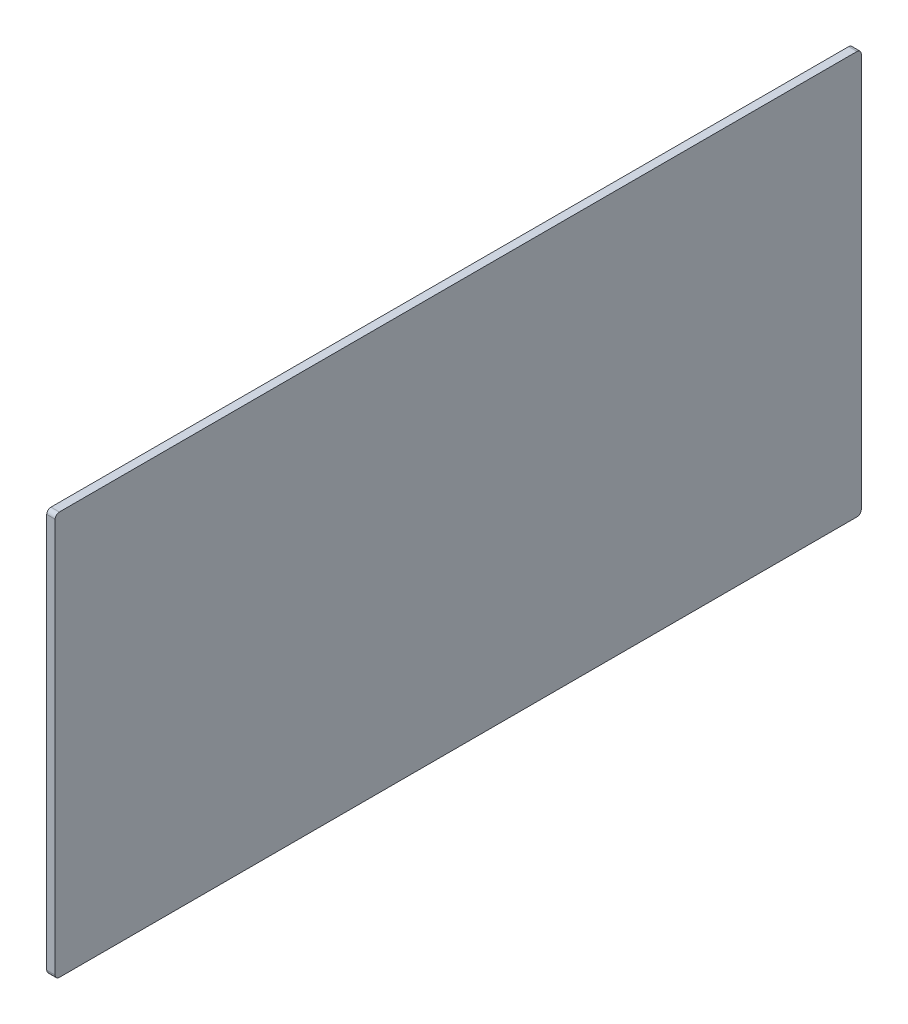
ISO-10303-21;
HEADER;
FILE_DESCRIPTION(('STEP AP214'),'2;1');
FILE_NAME('part.step','',(''),(''),'','','');
FILE_SCHEMA(('AUTOMOTIVE_DESIGN { 1 0 10303 214 1 1 1 1 }'));
ENDSEC;
DATA;
#1=APPLICATION_CONTEXT('core data for automotive mechanical design processes');
#2=APPLICATION_PROTOCOL_DEFINITION('international standard','automotive_design',2000,#1);
#3=PRODUCT_CONTEXT('',#1,'mechanical');
#4=PRODUCT('Part','Part','',(#3));
#5=PRODUCT_RELATED_PRODUCT_CATEGORY('part','',(#4));
#6=PRODUCT_DEFINITION_FORMATION('','',#4);
#7=PRODUCT_DEFINITION_CONTEXT('part definition',#1,'design');
#8=PRODUCT_DEFINITION('design','',#6,#7);
#9=PRODUCT_DEFINITION_SHAPE('','',#8);
#10=(LENGTH_UNIT() NAMED_UNIT(*) SI_UNIT(.MILLI.,.METRE.));
#11=(NAMED_UNIT(*) PLANE_ANGLE_UNIT() SI_UNIT($,.RADIAN.));
#12=(NAMED_UNIT(*) SI_UNIT($,.STERADIAN.) SOLID_ANGLE_UNIT());
#13=UNCERTAINTY_MEASURE_WITH_UNIT(LENGTH_MEASURE(1.E-05),#10,'distance_accuracy_value','');
#14=(GEOMETRIC_REPRESENTATION_CONTEXT(3) GLOBAL_UNCERTAINTY_ASSIGNED_CONTEXT((#13)) GLOBAL_UNIT_ASSIGNED_CONTEXT((#10,
#11,#12)) REPRESENTATION_CONTEXT('',''));
#15=CARTESIAN_POINT('',(0.,0.,0.));
#16=DIRECTION('',(0.,0.,1.));
#17=DIRECTION('',(1.,0.,0.));
#18=AXIS2_PLACEMENT_3D('',#15,#16,#17);
#19=CARTESIAN_POINT('',(6.35,0.,0.));
#20=DIRECTION('',(0.,0.,-1.));
#21=DIRECTION('',(-1.,0.,0.));
#22=AXIS2_PLACEMENT_3D('',#19,#20,#21);
#23=PLANE('',#22);
#24=DIRECTION('',(0.,-1.,0.));
#25=VECTOR('',#24,1.);
#26=CARTESIAN_POINT('',(0.,0.,0.));
#27=LINE('',#26,#25);
#28=CARTESIAN_POINT('',(0.,301.625,0.));
#29=VERTEX_POINT('',#28);
#30=CARTESIAN_POINT('',(0.,3.175,0.));
#31=VERTEX_POINT('',#30);
#32=EDGE_CURVE('E167',#29,#31,#27,.T.);
#33=ORIENTED_EDGE('',*,*,#32,.T.);
#34=DIRECTION('',(-1.,0.,0.));
#35=VECTOR('',#34,1.);
#36=CARTESIAN_POINT('',(6.35,3.175,0.));
#37=LINE('',#36,#35);
#38=CARTESIAN_POINT('',(6.35,3.175,0.));
#39=VERTEX_POINT('',#38);
#40=EDGE_CURVE('E11',#31,#39,#37,.F.);
#41=ORIENTED_EDGE('',*,*,#40,.T.);
#42=DIRECTION('',(0.,-1.,0.));
#43=VECTOR('',#42,1.);
#44=CARTESIAN_POINT('',(6.35,0.,0.));
#45=LINE('',#44,#43);
#46=CARTESIAN_POINT('',(6.35,301.625,0.));
#47=VERTEX_POINT('',#46);
#48=EDGE_CURVE('E135',#47,#39,#45,.T.);
#49=ORIENTED_EDGE('',*,*,#48,.F.);
#50=DIRECTION('',(-1.,0.,0.));
#51=VECTOR('',#50,1.);
#52=CARTESIAN_POINT('',(6.35,301.625,0.));
#53=LINE('',#52,#51);
#54=EDGE_CURVE('E51',#47,#29,#53,.T.);
#55=ORIENTED_EDGE('',*,*,#54,.T.);
#56=EDGE_LOOP('',(#33,#41,#49,#55));
#57=FACE_BOUND('',#56,.T.);
#58=ADVANCED_FACE('F43',(#57),#23,.F.);
#59=CARTESIAN_POINT('',(6.35,0.,0.));
#60=DIRECTION('',(0.,1.,0.));
#61=DIRECTION('',(0.,0.,1.));
#62=AXIS2_PLACEMENT_3D('',#59,#60,#61);
#63=PLANE('',#62);
#64=DIRECTION('',(0.,0.,-1.));
#65=VECTOR('',#64,1.);
#66=CARTESIAN_POINT('',(0.,0.,0.));
#67=LINE('',#66,#65);
#68=CARTESIAN_POINT('',(0.,0.,-3.175));
#69=VERTEX_POINT('',#68);
#70=CARTESIAN_POINT('',(0.,0.,-606.425));
#71=VERTEX_POINT('',#70);
#72=EDGE_CURVE('E140',#69,#71,#67,.T.);
#73=ORIENTED_EDGE('',*,*,#72,.T.);
#74=DIRECTION('',(-1.,0.,0.));
#75=VECTOR('',#74,1.);
#76=CARTESIAN_POINT('',(6.35,0.,-606.425));
#77=LINE('',#76,#75);
#78=CARTESIAN_POINT('',(6.35,0.,-606.425));
#79=VERTEX_POINT('',#78);
#80=EDGE_CURVE('E58',#71,#79,#77,.F.);
#81=ORIENTED_EDGE('',*,*,#80,.T.);
#82=DIRECTION('',(0.,0.,-1.));
#83=VECTOR('',#82,1.);
#84=CARTESIAN_POINT('',(6.35,0.,0.));
#85=LINE('',#84,#83);
#86=CARTESIAN_POINT('',(6.35,0.,-3.175));
#87=VERTEX_POINT('',#86);
#88=EDGE_CURVE('E138',#87,#79,#85,.T.);
#89=ORIENTED_EDGE('',*,*,#88,.F.);
#90=DIRECTION('',(-1.,0.,0.));
#91=VECTOR('',#90,1.);
#92=CARTESIAN_POINT('',(6.35,0.,-3.175));
#93=LINE('',#92,#91);
#94=EDGE_CURVE('E159',#87,#69,#93,.T.);
#95=ORIENTED_EDGE('',*,*,#94,.T.);
#96=EDGE_LOOP('',(#73,#81,#89,#95));
#97=FACE_BOUND('',#96,.T.);
#98=ADVANCED_FACE('F187',(#97),#63,.F.);
#99=CARTESIAN_POINT('',(6.35,0.,-609.6));
#100=DIRECTION('',(0.,0.,1.));
#101=DIRECTION('',(1.,0.,0.));
#102=AXIS2_PLACEMENT_3D('',#99,#100,#101);
#103=PLANE('',#102);
#104=DIRECTION('',(0.,1.,0.));
#105=VECTOR('',#104,1.);
#106=CARTESIAN_POINT('',(0.,0.,-609.6));
#107=LINE('',#106,#105);
#108=CARTESIAN_POINT('',(0.,3.175,-609.6));
#109=VERTEX_POINT('',#108);
#110=CARTESIAN_POINT('',(0.,301.625,-609.6));
#111=VERTEX_POINT('',#110);
#112=EDGE_CURVE('E136',#109,#111,#107,.T.);
#113=ORIENTED_EDGE('',*,*,#112,.T.);
#114=DIRECTION('',(-1.,0.,0.));
#115=VECTOR('',#114,1.);
#116=CARTESIAN_POINT('',(6.35,301.625,-609.6));
#117=LINE('',#116,#115);
#118=CARTESIAN_POINT('',(6.35,301.625,-609.6));
#119=VERTEX_POINT('',#118);
#120=EDGE_CURVE('E114',#111,#119,#117,.F.);
#121=ORIENTED_EDGE('',*,*,#120,.T.);
#122=DIRECTION('',(0.,1.,0.));
#123=VECTOR('',#122,1.);
#124=CARTESIAN_POINT('',(6.35,0.,-609.6));
#125=LINE('',#124,#123);
#126=CARTESIAN_POINT('',(6.35,3.175,-609.6));
#127=VERTEX_POINT('',#126);
#128=EDGE_CURVE('E175',#127,#119,#125,.T.);
#129=ORIENTED_EDGE('',*,*,#128,.F.);
#130=DIRECTION('',(-1.,0.,0.));
#131=VECTOR('',#130,1.);
#132=CARTESIAN_POINT('',(6.35,3.175,-609.6));
#133=LINE('',#132,#131);
#134=EDGE_CURVE('E119',#127,#109,#133,.T.);
#135=ORIENTED_EDGE('',*,*,#134,.T.);
#136=EDGE_LOOP('',(#113,#121,#129,#135));
#137=FACE_BOUND('',#136,.T.);
#138=ADVANCED_FACE('F186',(#137),#103,.F.);
#139=CARTESIAN_POINT('',(6.35,304.8,0.));
#140=DIRECTION('',(0.,-1.,0.));
#141=DIRECTION('',(0.,0.,-1.));
#142=AXIS2_PLACEMENT_3D('',#139,#140,#141);
#143=PLANE('',#142);
#144=DIRECTION('',(0.,0.,1.));
#145=VECTOR('',#144,1.);
#146=CARTESIAN_POINT('',(6.35,304.8,0.));
#147=LINE('',#146,#145);
#148=CARTESIAN_POINT('',(6.35,304.8,-606.425));
#149=VERTEX_POINT('',#148);
#150=CARTESIAN_POINT('',(6.35,304.8,-3.175));
#151=VERTEX_POINT('',#150);
#152=EDGE_CURVE('E129',#149,#151,#147,.T.);
#153=ORIENTED_EDGE('',*,*,#152,.F.);
#154=DIRECTION('',(-1.,0.,0.));
#155=VECTOR('',#154,1.);
#156=CARTESIAN_POINT('',(6.35,304.8,-606.425));
#157=LINE('',#156,#155);
#158=CARTESIAN_POINT('',(0.,304.8,-606.425));
#159=VERTEX_POINT('',#158);
#160=EDGE_CURVE('E113',#149,#159,#157,.T.);
#161=ORIENTED_EDGE('',*,*,#160,.T.);
#162=DIRECTION('',(0.,0.,1.));
#163=VECTOR('',#162,1.);
#164=CARTESIAN_POINT('',(0.,304.8,0.));
#165=LINE('',#164,#163);
#166=CARTESIAN_POINT('',(0.,304.8,-3.175));
#167=VERTEX_POINT('',#166);
#168=EDGE_CURVE('E126',#159,#167,#165,.T.);
#169=ORIENTED_EDGE('',*,*,#168,.T.);
#170=DIRECTION('',(-1.,0.,0.));
#171=VECTOR('',#170,1.);
#172=CARTESIAN_POINT('',(6.35,304.8,-3.175));
#173=LINE('',#172,#171);
#174=EDGE_CURVE('E131',#167,#151,#173,.F.);
#175=ORIENTED_EDGE('',*,*,#174,.T.);
#176=EDGE_LOOP('',(#153,#161,#169,#175));
#177=FACE_BOUND('',#176,.T.);
#178=ADVANCED_FACE('F125',(#177),#143,.F.);
#179=CARTESIAN_POINT('',(6.35,0.,0.));
#180=DIRECTION('',(-1.,0.,0.));
#181=DIRECTION('',(0.,0.,1.));
#182=AXIS2_PLACEMENT_3D('',#179,#180,#181);
#183=PLANE('',#182);
#184=ORIENTED_EDGE('',*,*,#128,.T.);
#185=CARTESIAN_POINT('',(6.35,301.625,-606.425));
#186=DIRECTION('',(-1.,0.,0.));
#187=DIRECTION('',(0.,0.,1.));
#188=AXIS2_PLACEMENT_3D('',#185,#186,#187);
#189=CIRCLE('',#188,3.175);
#190=EDGE_CURVE('E157',#119,#149,#189,.F.);
#191=ORIENTED_EDGE('',*,*,#190,.T.);
#192=ORIENTED_EDGE('',*,*,#152,.T.);
#193=CARTESIAN_POINT('',(6.35,301.625,-3.175));
#194=DIRECTION('',(-1.,0.,0.));
#195=DIRECTION('',(0.,0.,1.));
#196=AXIS2_PLACEMENT_3D('',#193,#194,#195);
#197=CIRCLE('',#196,3.175);
#198=EDGE_CURVE('E152',#151,#47,#197,.F.);
#199=ORIENTED_EDGE('',*,*,#198,.T.);
#200=ORIENTED_EDGE('',*,*,#48,.T.);
#201=CARTESIAN_POINT('',(6.35,3.175,-3.175));
#202=DIRECTION('',(-1.,0.,0.));
#203=DIRECTION('',(0.,0.,1.));
#204=AXIS2_PLACEMENT_3D('',#201,#202,#203);
#205=CIRCLE('',#204,3.175);
#206=EDGE_CURVE('E65',#39,#87,#205,.F.);
#207=ORIENTED_EDGE('',*,*,#206,.T.);
#208=ORIENTED_EDGE('',*,*,#88,.T.);
#209=CARTESIAN_POINT('',(6.35,3.175,-606.425));
#210=DIRECTION('',(-1.,0.,0.));
#211=DIRECTION('',(0.,0.,1.));
#212=AXIS2_PLACEMENT_3D('',#209,#210,#211);
#213=CIRCLE('',#212,3.175);
#214=EDGE_CURVE('E155',#79,#127,#213,.F.);
#215=ORIENTED_EDGE('',*,*,#214,.T.);
#216=EDGE_LOOP('',(#184,#191,#192,#199,#200,#207,#208,#215));
#217=FACE_BOUND('',#216,.T.);
#218=ADVANCED_FACE('F179',(#217),#183,.F.);
#219=CARTESIAN_POINT('',(0.,0.,0.));
#220=DIRECTION('',(-1.,0.,0.));
#221=DIRECTION('',(0.,0.,1.));
#222=AXIS2_PLACEMENT_3D('',#219,#220,#221);
#223=PLANE('',#222);
#224=ORIENTED_EDGE('',*,*,#168,.F.);
#225=CARTESIAN_POINT('',(0.,301.625,-606.425));
#226=DIRECTION('',(-1.,0.,0.));
#227=DIRECTION('',(0.,0.,1.));
#228=AXIS2_PLACEMENT_3D('',#225,#226,#227);
#229=CIRCLE('',#228,3.175);
#230=EDGE_CURVE('E109',#159,#111,#229,.T.);
#231=ORIENTED_EDGE('',*,*,#230,.T.);
#232=ORIENTED_EDGE('',*,*,#112,.F.);
#233=CARTESIAN_POINT('',(0.,3.175,-606.425));
#234=DIRECTION('',(-1.,0.,0.));
#235=DIRECTION('',(0.,0.,1.));
#236=AXIS2_PLACEMENT_3D('',#233,#234,#235);
#237=CIRCLE('',#236,3.175);
#238=EDGE_CURVE('E120',#109,#71,#237,.T.);
#239=ORIENTED_EDGE('',*,*,#238,.T.);
#240=ORIENTED_EDGE('',*,*,#72,.F.);
#241=CARTESIAN_POINT('',(0.,3.175,-3.175));
#242=DIRECTION('',(-1.,0.,0.));
#243=DIRECTION('',(0.,0.,1.));
#244=AXIS2_PLACEMENT_3D('',#241,#242,#243);
#245=CIRCLE('',#244,3.175);
#246=EDGE_CURVE('E146',#69,#31,#245,.T.);
#247=ORIENTED_EDGE('',*,*,#246,.T.);
#248=ORIENTED_EDGE('',*,*,#32,.F.);
#249=CARTESIAN_POINT('',(0.,301.625,-3.175));
#250=DIRECTION('',(-1.,0.,0.));
#251=DIRECTION('',(0.,0.,1.));
#252=AXIS2_PLACEMENT_3D('',#249,#250,#251);
#253=CIRCLE('',#252,3.175);
#254=EDGE_CURVE('E130',#29,#167,#253,.T.);
#255=ORIENTED_EDGE('',*,*,#254,.T.);
#256=EDGE_LOOP('',(#224,#231,#232,#239,#240,#247,#248,#255));
#257=FACE_BOUND('',#256,.T.);
#258=ADVANCED_FACE('F133',(#257),#223,.T.);
#259=CARTESIAN_POINT('',(6.35,301.625,-606.425));
#260=DIRECTION('',(-1.,0.,0.));
#261=DIRECTION('',(0.,0.,1.));
#262=AXIS2_PLACEMENT_3D('',#259,#260,#261);
#263=CYLINDRICAL_SURFACE('',#262,3.175);
#264=ORIENTED_EDGE('',*,*,#190,.F.);
#265=ORIENTED_EDGE('',*,*,#120,.F.);
#266=ORIENTED_EDGE('',*,*,#230,.F.);
#267=ORIENTED_EDGE('',*,*,#160,.F.);
#268=EDGE_LOOP('',(#264,#265,#266,#267));
#269=FACE_BOUND('',#268,.T.);
#270=ADVANCED_FACE('F112',(#269),#263,.T.);
#271=CARTESIAN_POINT('',(6.35,3.175,-606.425));
#272=DIRECTION('',(-1.,0.,0.));
#273=DIRECTION('',(0.,0.,1.));
#274=AXIS2_PLACEMENT_3D('',#271,#272,#273);
#275=CYLINDRICAL_SURFACE('',#274,3.175);
#276=ORIENTED_EDGE('',*,*,#214,.F.);
#277=ORIENTED_EDGE('',*,*,#80,.F.);
#278=ORIENTED_EDGE('',*,*,#238,.F.);
#279=ORIENTED_EDGE('',*,*,#134,.F.);
#280=EDGE_LOOP('',(#276,#277,#278,#279));
#281=FACE_BOUND('',#280,.T.);
#282=ADVANCED_FACE('F184',(#281),#275,.T.);
#283=CARTESIAN_POINT('',(6.35,3.175,-3.175));
#284=DIRECTION('',(-1.,0.,0.));
#285=DIRECTION('',(0.,0.,1.));
#286=AXIS2_PLACEMENT_3D('',#283,#284,#285);
#287=CYLINDRICAL_SURFACE('',#286,3.175);
#288=ORIENTED_EDGE('',*,*,#206,.F.);
#289=ORIENTED_EDGE('',*,*,#40,.F.);
#290=ORIENTED_EDGE('',*,*,#246,.F.);
#291=ORIENTED_EDGE('',*,*,#94,.F.);
#292=EDGE_LOOP('',(#288,#289,#290,#291));
#293=FACE_BOUND('',#292,.T.);
#294=ADVANCED_FACE('F189',(#293),#287,.T.);
#295=CARTESIAN_POINT('',(6.35,301.625,-3.175));
#296=DIRECTION('',(-1.,0.,0.));
#297=DIRECTION('',(0.,0.,1.));
#298=AXIS2_PLACEMENT_3D('',#295,#296,#297);
#299=CYLINDRICAL_SURFACE('',#298,3.175);
#300=ORIENTED_EDGE('',*,*,#198,.F.);
#301=ORIENTED_EDGE('',*,*,#174,.F.);
#302=ORIENTED_EDGE('',*,*,#254,.F.);
#303=ORIENTED_EDGE('',*,*,#54,.F.);
#304=EDGE_LOOP('',(#300,#301,#302,#303));
#305=FACE_BOUND('',#304,.T.);
#306=ADVANCED_FACE('F45',(#305),#299,.T.);
#307=CLOSED_SHELL('',(#58,#98,#138,#178,#218,#258,#270,#282,#294,#306));
#308=MANIFOLD_SOLID_BREP('B2',#307);
#309=ADVANCED_BREP_SHAPE_REPRESENTATION('',(#18,#308),#14);
#310=SHAPE_DEFINITION_REPRESENTATION(#9,#309);
ENDSEC;
END-ISO-10303-21;
